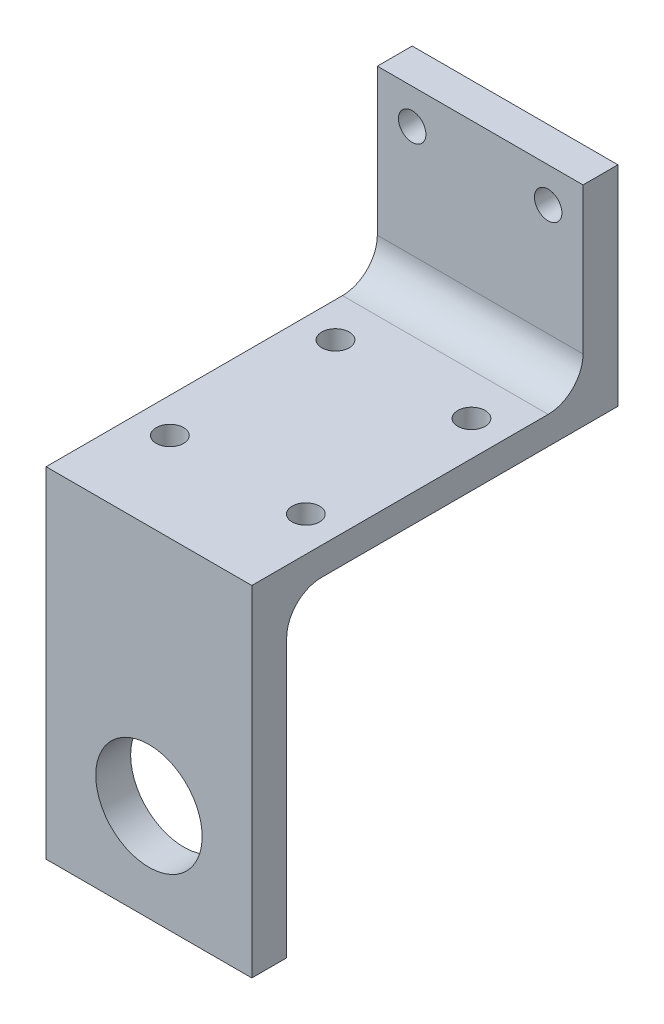
ISO-10303-21;
HEADER;
FILE_DESCRIPTION(('STEP AP214'),'2;1');
FILE_NAME('part.step','',(''),(''),'','','');
FILE_SCHEMA(('AUTOMOTIVE_DESIGN { 1 0 10303 214 1 1 1 1 }'));
ENDSEC;
DATA;
#1=APPLICATION_CONTEXT('core data for automotive mechanical design processes');
#2=APPLICATION_PROTOCOL_DEFINITION('international standard','automotive_design',2000,#1);
#3=PRODUCT_CONTEXT('',#1,'mechanical');
#4=PRODUCT('Part','Part','',(#3));
#5=PRODUCT_RELATED_PRODUCT_CATEGORY('part','',(#4));
#6=PRODUCT_DEFINITION_FORMATION('','',#4);
#7=PRODUCT_DEFINITION_CONTEXT('part definition',#1,'design');
#8=PRODUCT_DEFINITION('design','',#6,#7);
#9=PRODUCT_DEFINITION_SHAPE('','',#8);
#10=(LENGTH_UNIT() NAMED_UNIT(*) SI_UNIT(.MILLI.,.METRE.));
#11=(NAMED_UNIT(*) PLANE_ANGLE_UNIT() SI_UNIT($,.RADIAN.));
#12=(NAMED_UNIT(*) SI_UNIT($,.STERADIAN.) SOLID_ANGLE_UNIT());
#13=UNCERTAINTY_MEASURE_WITH_UNIT(LENGTH_MEASURE(1.E-05),#10,'distance_accuracy_value','');
#14=(GEOMETRIC_REPRESENTATION_CONTEXT(3) GLOBAL_UNCERTAINTY_ASSIGNED_CONTEXT((#13)) GLOBAL_UNIT_ASSIGNED_CONTEXT((#10,
#11,#12)) REPRESENTATION_CONTEXT('',''));
#15=CARTESIAN_POINT('',(0.,0.,0.));
#16=DIRECTION('',(0.,0.,1.));
#17=DIRECTION('',(1.,0.,0.));
#18=AXIS2_PLACEMENT_3D('',#15,#16,#17);
#19=CARTESIAN_POINT('',(29.972,0.,36.5701998870482));
#20=DIRECTION('',(0.,0.,-1.));
#21=DIRECTION('',(0.,1.,0.));
#22=AXIS2_PLACEMENT_3D('',#19,#20,#21);
#23=PLANE('',#22);
#24=CARTESIAN_POINT('',(14.986,-44.1568439202567,36.5701998870482));
#25=DIRECTION('',(0.,0.,-1.));
#26=DIRECTION('',(-1.,0.,0.));
#27=AXIS2_PLACEMENT_3D('',#24,#25,#26);
#28=CIRCLE('',#27,7.75);
#29=CARTESIAN_POINT('',(7.236,-44.1568439202567,36.5701998870482));
#30=VERTEX_POINT('',#29);
#31=EDGE_CURVE('E530',#30,#30,#28,.T.);
#32=ORIENTED_EDGE('',*,*,#31,.F.);
#33=EDGE_LOOP('',(#32));
#34=FACE_BOUND('',#33,.T.);
#35=DIRECTION('',(0.,-1.,0.));
#36=VECTOR('',#35,1.);
#37=CARTESIAN_POINT('',(0.,0.,36.5701998870482));
#38=LINE('',#37,#36);
#39=CARTESIAN_POINT('',(0.,-17.9948439202567,36.5701998870482));
#40=VERTEX_POINT('',#39);
#41=CARTESIAN_POINT('',(0.,-58.3808439202567,36.5701998870482));
#42=VERTEX_POINT('',#41);
#43=EDGE_CURVE('E207',#40,#42,#38,.T.);
#44=ORIENTED_EDGE('',*,*,#43,.F.);
#45=DIRECTION('',(-1.,0.,0.));
#46=VECTOR('',#45,1.);
#47=CARTESIAN_POINT('',(29.972,-17.9948439202567,36.5701998870482));
#48=LINE('',#47,#46);
#49=CARTESIAN_POINT('',(29.972,-17.9948439202567,36.5701998870482));
#50=VERTEX_POINT('',#49);
#51=EDGE_CURVE('E216',#40,#50,#48,.F.);
#52=ORIENTED_EDGE('',*,*,#51,.T.);
#53=DIRECTION('',(0.,-1.,0.));
#54=VECTOR('',#53,1.);
#55=CARTESIAN_POINT('',(29.972,0.,36.5701998870482));
#56=LINE('',#55,#54);
#57=CARTESIAN_POINT('',(29.972,-58.3808439202567,36.5701998870482));
#58=VERTEX_POINT('',#57);
#59=EDGE_CURVE('E260',#50,#58,#56,.T.);
#60=ORIENTED_EDGE('',*,*,#59,.T.);
#61=DIRECTION('',(-1.,0.,0.));
#62=VECTOR('',#61,1.);
#63=CARTESIAN_POINT('',(29.972,-58.3808439202567,36.5701998870482));
#64=LINE('',#63,#62);
#65=EDGE_CURVE('E267',#58,#42,#64,.T.);
#66=ORIENTED_EDGE('',*,*,#65,.T.);
#67=EDGE_LOOP('',(#44,#52,#60,#66));
#68=FACE_BOUND('',#67,.T.);
#69=ADVANCED_FACE('F71',(#34,#68),#23,.T.);
#70=CARTESIAN_POINT('',(29.972,0.,41.6501998870482));
#71=DIRECTION('',(0.,0.,-1.));
#72=DIRECTION('',(0.,1.,0.));
#73=AXIS2_PLACEMENT_3D('',#70,#71,#72);
#74=PLANE('',#73);
#75=CARTESIAN_POINT('',(14.986,-44.1568439202567,41.6501998870482));
#76=DIRECTION('',(0.,0.,-1.));
#77=DIRECTION('',(0.,1.,0.));
#78=AXIS2_PLACEMENT_3D('',#75,#76,#77);
#79=CIRCLE('',#78,7.75);
#80=CARTESIAN_POINT('',(14.986,-36.4068439202567,41.6501998870482));
#81=VERTEX_POINT('',#80);
#82=EDGE_CURVE('E528',#81,#81,#79,.F.);
#83=ORIENTED_EDGE('',*,*,#82,.F.);
#84=EDGE_LOOP('',(#83));
#85=FACE_BOUND('',#84,.T.);
#86=DIRECTION('',(0.,-1.,0.));
#87=VECTOR('',#86,1.);
#88=CARTESIAN_POINT('',(0.,0.,41.6501998870482));
#89=LINE('',#88,#87);
#90=CARTESIAN_POINT('',(0.,-8.85084392025667,41.6501998870482));
#91=VERTEX_POINT('',#90);
#92=CARTESIAN_POINT('',(0.,-58.3808439202567,41.6501998870482));
#93=VERTEX_POINT('',#92);
#94=EDGE_CURVE('E211',#91,#93,#89,.T.);
#95=ORIENTED_EDGE('',*,*,#94,.T.);
#96=DIRECTION('',(-1.,0.,0.));
#97=VECTOR('',#96,1.);
#98=CARTESIAN_POINT('',(29.972,-58.3808439202567,41.6501998870482));
#99=LINE('',#98,#97);
#100=CARTESIAN_POINT('',(29.972,-58.3808439202567,41.6501998870482));
#101=VERTEX_POINT('',#100);
#102=EDGE_CURVE('E217',#101,#93,#99,.T.);
#103=ORIENTED_EDGE('',*,*,#102,.F.);
#104=DIRECTION('',(0.,-1.,0.));
#105=VECTOR('',#104,1.);
#106=CARTESIAN_POINT('',(29.972,0.,41.6501998870482));
#107=LINE('',#106,#105);
#108=CARTESIAN_POINT('',(29.972,-8.85084392025667,41.6501998870482));
#109=VERTEX_POINT('',#108);
#110=EDGE_CURVE('E262',#109,#101,#107,.T.);
#111=ORIENTED_EDGE('',*,*,#110,.F.);
#112=DIRECTION('',(-1.,0.,0.));
#113=VECTOR('',#112,1.);
#114=CARTESIAN_POINT('',(29.972,-8.85084392025667,41.6501998870482));
#115=LINE('',#114,#113);
#116=EDGE_CURVE('E204',#109,#91,#115,.T.);
#117=ORIENTED_EDGE('',*,*,#116,.T.);
#118=EDGE_LOOP('',(#95,#103,#111,#117));
#119=FACE_BOUND('',#118,.T.);
#120=ADVANCED_FACE('F322',(#85,#119),#74,.F.);
#121=CARTESIAN_POINT('',(29.972,-58.3808439202567,0.));
#122=DIRECTION('',(0.,1.,0.));
#123=DIRECTION('',(0.,0.,1.));
#124=AXIS2_PLACEMENT_3D('',#121,#122,#123);
#125=PLANE('',#124);
#126=DIRECTION('',(0.,0.,-1.));
#127=VECTOR('',#126,1.);
#128=CARTESIAN_POINT('',(0.,-58.3808439202567,0.));
#129=LINE('',#128,#127);
#130=EDGE_CURVE('E263',#93,#42,#129,.T.);
#131=ORIENTED_EDGE('',*,*,#130,.T.);
#132=ORIENTED_EDGE('',*,*,#65,.F.);
#133=DIRECTION('',(0.,0.,-1.));
#134=VECTOR('',#133,1.);
#135=CARTESIAN_POINT('',(29.972,-58.3808439202567,0.));
#136=LINE('',#135,#134);
#137=EDGE_CURVE('E265',#101,#58,#136,.T.);
#138=ORIENTED_EDGE('',*,*,#137,.F.);
#139=ORIENTED_EDGE('',*,*,#102,.T.);
#140=EDGE_LOOP('',(#131,#132,#138,#139));
#141=FACE_BOUND('',#140,.T.);
#142=ADVANCED_FACE('F327',(#141),#125,.F.);
#143=CARTESIAN_POINT('',(29.972,0.,0.));
#144=DIRECTION('',(1.,0.,0.));
#145=DIRECTION('',(0.,0.,-1.));
#146=AXIS2_PLACEMENT_3D('',#143,#144,#145);
#147=PLANE('',#146);
#148=ORIENTED_EDGE('',*,*,#59,.F.);
#149=CARTESIAN_POINT('',(29.972,-17.9948439202567,31.4901998870482));
#150=DIRECTION('',(1.,0.,0.));
#151=DIRECTION('',(0.,0.,-1.));
#152=AXIS2_PLACEMENT_3D('',#149,#150,#151);
#153=CIRCLE('',#152,5.08);
#154=CARTESIAN_POINT('',(29.972,-12.9148439202567,31.4901998870482));
#155=VERTEX_POINT('',#154);
#156=EDGE_CURVE('E226',#50,#155,#153,.F.);
#157=ORIENTED_EDGE('',*,*,#156,.T.);
#158=DIRECTION('',(0.,0.,1.));
#159=VECTOR('',#158,1.);
#160=CARTESIAN_POINT('',(29.972,-12.9148439202567,-11.6898001129518));
#161=LINE('',#160,#159);
#162=CARTESIAN_POINT('',(29.972,-12.9148439202567,-11.6898001129518));
#163=VERTEX_POINT('',#162);
#164=EDGE_CURVE('E278',#163,#155,#161,.T.);
#165=ORIENTED_EDGE('',*,*,#164,.F.);
#166=DIRECTION('',(0.,-1.,0.));
#167=VECTOR('',#166,1.);
#168=CARTESIAN_POINT('',(29.972,17.5651560797433,-11.6898001129518));
#169=LINE('',#168,#167);
#170=CARTESIAN_POINT('',(29.972,17.5651560797433,-11.6898001129518));
#171=VERTEX_POINT('',#170);
#172=EDGE_CURVE('E282',#171,#163,#169,.T.);
#173=ORIENTED_EDGE('',*,*,#172,.F.);
#174=DIRECTION('',(0.,0.,-1.));
#175=VECTOR('',#174,1.);
#176=CARTESIAN_POINT('',(29.972,17.5651560797433,-6.60980011295181));
#177=LINE('',#176,#175);
#178=CARTESIAN_POINT('',(29.972,17.5651560797433,-6.60980011295181));
#179=VERTEX_POINT('',#178);
#180=EDGE_CURVE('E284',#179,#171,#177,.T.);
#181=ORIENTED_EDGE('',*,*,#180,.F.);
#182=DIRECTION('',(0.,1.,0.));
#183=VECTOR('',#182,1.);
#184=CARTESIAN_POINT('',(29.972,-8.85084392025666,-6.60980011295181));
#185=LINE('',#184,#183);
#186=CARTESIAN_POINT('',(29.972,-3.77084392025666,-6.60980011295181));
#187=VERTEX_POINT('',#186);
#188=EDGE_CURVE('E287',#187,#179,#185,.T.);
#189=ORIENTED_EDGE('',*,*,#188,.F.);
#190=CARTESIAN_POINT('',(29.972,-3.77084392025666,-1.52980011295181));
#191=DIRECTION('',(1.,0.,0.));
#192=DIRECTION('',(0.,0.,-1.));
#193=AXIS2_PLACEMENT_3D('',#190,#191,#192);
#194=CIRCLE('',#193,5.08);
#195=CARTESIAN_POINT('',(29.972,-8.85084392025666,-1.52980011295181));
#196=VERTEX_POINT('',#195);
#197=EDGE_CURVE('E230',#187,#196,#194,.F.);
#198=ORIENTED_EDGE('',*,*,#197,.T.);
#199=DIRECTION('',(0.,0.,1.));
#200=VECTOR('',#199,1.);
#201=CARTESIAN_POINT('',(29.972,-8.85084392025666,-6.60980011295181));
#202=LINE('',#201,#200);
#203=EDGE_CURVE('E276',#196,#109,#202,.T.);
#204=ORIENTED_EDGE('',*,*,#203,.T.);
#205=ORIENTED_EDGE('',*,*,#110,.T.);
#206=ORIENTED_EDGE('',*,*,#137,.T.);
#207=EDGE_LOOP('',(#148,#157,#165,#173,#181,#189,#198,#204,#205,#206));
#208=FACE_BOUND('',#207,.T.);
#209=ADVANCED_FACE('F320',(#208),#147,.T.);
#210=CARTESIAN_POINT('',(0.,0.,0.));
#211=DIRECTION('',(1.,0.,0.));
#212=DIRECTION('',(0.,0.,-1.));
#213=AXIS2_PLACEMENT_3D('',#210,#211,#212);
#214=PLANE('',#213);
#215=DIRECTION('',(0.,0.,1.));
#216=VECTOR('',#215,1.);
#217=CARTESIAN_POINT('',(0.,-12.9148439202567,-11.6898001129518));
#218=LINE('',#217,#216);
#219=CARTESIAN_POINT('',(0.,-12.9148439202567,-11.6898001129518));
#220=VERTEX_POINT('',#219);
#221=CARTESIAN_POINT('',(0.,-12.9148439202567,31.4901998870482));
#222=VERTEX_POINT('',#221);
#223=EDGE_CURVE('E195',#220,#222,#218,.T.);
#224=ORIENTED_EDGE('',*,*,#223,.T.);
#225=CARTESIAN_POINT('',(0.,-17.9948439202567,31.4901998870482));
#226=DIRECTION('',(1.,0.,0.));
#227=DIRECTION('',(0.,0.,-1.));
#228=AXIS2_PLACEMENT_3D('',#225,#226,#227);
#229=CIRCLE('',#228,5.08);
#230=EDGE_CURVE('E224',#222,#40,#229,.T.);
#231=ORIENTED_EDGE('',*,*,#230,.T.);
#232=ORIENTED_EDGE('',*,*,#43,.T.);
#233=ORIENTED_EDGE('',*,*,#130,.F.);
#234=ORIENTED_EDGE('',*,*,#94,.F.);
#235=DIRECTION('',(0.,0.,1.));
#236=VECTOR('',#235,1.);
#237=CARTESIAN_POINT('',(0.,-8.85084392025666,-6.60980011295181));
#238=LINE('',#237,#236);
#239=CARTESIAN_POINT('',(0.,-8.85084392025666,-1.52980011295181));
#240=VERTEX_POINT('',#239);
#241=EDGE_CURVE('E259',#240,#91,#238,.T.);
#242=ORIENTED_EDGE('',*,*,#241,.F.);
#243=CARTESIAN_POINT('',(0.,-3.77084392025666,-1.52980011295181));
#244=DIRECTION('',(1.,0.,0.));
#245=DIRECTION('',(0.,0.,-1.));
#246=AXIS2_PLACEMENT_3D('',#243,#244,#245);
#247=CIRCLE('',#246,5.08);
#248=CARTESIAN_POINT('',(0.,-3.77084392025666,-6.60980011295181));
#249=VERTEX_POINT('',#248);
#250=EDGE_CURVE('E228',#240,#249,#247,.T.);
#251=ORIENTED_EDGE('',*,*,#250,.T.);
#252=DIRECTION('',(0.,1.,0.));
#253=VECTOR('',#252,1.);
#254=CARTESIAN_POINT('',(0.,-8.85084392025666,-6.60980011295181));
#255=LINE('',#254,#253);
#256=CARTESIAN_POINT('',(0.,17.5651560797433,-6.60980011295181));
#257=VERTEX_POINT('',#256);
#258=EDGE_CURVE('E279',#249,#257,#255,.T.);
#259=ORIENTED_EDGE('',*,*,#258,.T.);
#260=DIRECTION('',(0.,0.,-1.));
#261=VECTOR('',#260,1.);
#262=CARTESIAN_POINT('',(0.,17.5651560797433,-6.60980011295181));
#263=LINE('',#262,#261);
#264=CARTESIAN_POINT('',(0.,17.5651560797433,-11.6898001129518));
#265=VERTEX_POINT('',#264);
#266=EDGE_CURVE('E293',#257,#265,#263,.T.);
#267=ORIENTED_EDGE('',*,*,#266,.T.);
#268=DIRECTION('',(0.,-1.,0.));
#269=VECTOR('',#268,1.);
#270=CARTESIAN_POINT('',(0.,17.5651560797433,-11.6898001129518));
#271=LINE('',#270,#269);
#272=EDGE_CURVE('E291',#265,#220,#271,.T.);
#273=ORIENTED_EDGE('',*,*,#272,.T.);
#274=EDGE_LOOP('',(#224,#231,#232,#233,#234,#242,#251,#259,#267,#273));
#275=FACE_BOUND('',#274,.T.);
#276=ADVANCED_FACE('F309',(#275),#214,.F.);
#277=CARTESIAN_POINT('',(29.972,-8.85084392025666,-6.60980011295181));
#278=DIRECTION('',(0.,0.,1.));
#279=DIRECTION('',(1.,0.,0.));
#280=AXIS2_PLACEMENT_3D('',#277,#278,#279);
#281=PLANE('',#280);
#282=CARTESIAN_POINT('',(5.08,12.4851560797433,-6.60980011295181));
#283=DIRECTION('',(0.,0.,1.));
#284=DIRECTION('',(1.,0.,0.));
#285=AXIS2_PLACEMENT_3D('',#282,#283,#284);
#286=CIRCLE('',#285,2.);
#287=CARTESIAN_POINT('',(7.08,12.4851560797433,-6.60980011295181));
#288=VERTEX_POINT('',#287);
#289=EDGE_CURVE('E247',#288,#288,#286,.F.);
#290=ORIENTED_EDGE('',*,*,#289,.T.);
#291=EDGE_LOOP('',(#290));
#292=FACE_BOUND('',#291,.T.);
#293=CARTESIAN_POINT('',(24.892,12.4851560797433,-6.60980011295181));
#294=DIRECTION('',(0.,0.,1.));
#295=DIRECTION('',(1.,0.,0.));
#296=AXIS2_PLACEMENT_3D('',#293,#294,#295);
#297=CIRCLE('',#296,2.);
#298=CARTESIAN_POINT('',(26.892,12.4851560797433,-6.60980011295181));
#299=VERTEX_POINT('',#298);
#300=EDGE_CURVE('E256',#299,#299,#297,.F.);
#301=ORIENTED_EDGE('',*,*,#300,.T.);
#302=EDGE_LOOP('',(#301));
#303=FACE_BOUND('',#302,.T.);
#304=ORIENTED_EDGE('',*,*,#258,.F.);
#305=DIRECTION('',(-1.,0.,0.));
#306=VECTOR('',#305,1.);
#307=CARTESIAN_POINT('',(29.972,-3.77084392025666,-6.60980011295181));
#308=LINE('',#307,#306);
#309=EDGE_CURVE('E222',#249,#187,#308,.F.);
#310=ORIENTED_EDGE('',*,*,#309,.T.);
#311=ORIENTED_EDGE('',*,*,#188,.T.);
#312=DIRECTION('',(-1.,0.,0.));
#313=VECTOR('',#312,1.);
#314=CARTESIAN_POINT('',(29.972,17.5651560797433,-6.60980011295181));
#315=LINE('',#314,#313);
#316=EDGE_CURVE('E200',#179,#257,#315,.T.);
#317=ORIENTED_EDGE('',*,*,#316,.T.);
#318=EDGE_LOOP('',(#304,#310,#311,#317));
#319=FACE_BOUND('',#318,.T.);
#320=ADVANCED_FACE('F302',(#292,#303,#319),#281,.T.);
#321=CARTESIAN_POINT('',(29.972,17.5651560797433,-6.60980011295181));
#322=DIRECTION('',(0.,1.,0.));
#323=DIRECTION('',(0.,0.,1.));
#324=AXIS2_PLACEMENT_3D('',#321,#322,#323);
#325=PLANE('',#324);
#326=ORIENTED_EDGE('',*,*,#266,.F.);
#327=ORIENTED_EDGE('',*,*,#316,.F.);
#328=ORIENTED_EDGE('',*,*,#180,.T.);
#329=DIRECTION('',(-1.,0.,0.));
#330=VECTOR('',#329,1.);
#331=CARTESIAN_POINT('',(29.972,17.5651560797433,-11.6898001129518));
#332=LINE('',#331,#330);
#333=EDGE_CURVE('E197',#171,#265,#332,.T.);
#334=ORIENTED_EDGE('',*,*,#333,.T.);
#335=EDGE_LOOP('',(#326,#327,#328,#334));
#336=FACE_BOUND('',#335,.T.);
#337=ADVANCED_FACE('F307',(#336),#325,.T.);
#338=CARTESIAN_POINT('',(29.972,-8.85084392025666,-6.60980011295181));
#339=DIRECTION('',(0.,-1.,0.));
#340=DIRECTION('',(0.,0.,-1.));
#341=AXIS2_PLACEMENT_3D('',#338,#339,#340);
#342=PLANE('',#341);
#343=CARTESIAN_POINT('',(5.08,-8.85084392025666,4.56619988704819));
#344=DIRECTION('',(0.,-1.,0.));
#345=DIRECTION('',(0.,0.,-1.));
#346=AXIS2_PLACEMENT_3D('',#343,#344,#345);
#347=CIRCLE('',#346,2.);
#348=CARTESIAN_POINT('',(5.08,-8.85084392025666,2.56619988704819));
#349=VERTEX_POINT('',#348);
#350=EDGE_CURVE('E251',#349,#349,#347,.T.);
#351=ORIENTED_EDGE('',*,*,#350,.T.);
#352=EDGE_LOOP('',(#351));
#353=FACE_BOUND('',#352,.T.);
#354=CARTESIAN_POINT('',(24.892,-8.85084392025666,28.6961998870482));
#355=DIRECTION('',(0.,-1.,0.));
#356=DIRECTION('',(0.,0.,-1.));
#357=AXIS2_PLACEMENT_3D('',#354,#355,#356);
#358=CIRCLE('',#357,2.);
#359=CARTESIAN_POINT('',(24.892,-8.85084392025666,26.6961998870482));
#360=VERTEX_POINT('',#359);
#361=EDGE_CURVE('E394',#360,#360,#358,.T.);
#362=ORIENTED_EDGE('',*,*,#361,.T.);
#363=EDGE_LOOP('',(#362));
#364=FACE_BOUND('',#363,.T.);
#365=CARTESIAN_POINT('',(5.08,-8.85084392025666,28.6961998870482));
#366=DIRECTION('',(0.,-1.,0.));
#367=DIRECTION('',(0.,0.,-1.));
#368=AXIS2_PLACEMENT_3D('',#365,#366,#367);
#369=CIRCLE('',#368,2.);
#370=CARTESIAN_POINT('',(5.08,-8.85084392025666,26.6961998870482));
#371=VERTEX_POINT('',#370);
#372=EDGE_CURVE('E387',#371,#371,#369,.T.);
#373=ORIENTED_EDGE('',*,*,#372,.T.);
#374=EDGE_LOOP('',(#373));
#375=FACE_BOUND('',#374,.T.);
#376=CARTESIAN_POINT('',(24.892,-8.85084392025666,4.56619988704819));
#377=DIRECTION('',(0.,-1.,0.));
#378=DIRECTION('',(0.,0.,-1.));
#379=AXIS2_PLACEMENT_3D('',#376,#377,#378);
#380=CIRCLE('',#379,2.);
#381=CARTESIAN_POINT('',(24.892,-8.85084392025666,2.56619988704819));
#382=VERTEX_POINT('',#381);
#383=EDGE_CURVE('E384',#382,#382,#380,.T.);
#384=ORIENTED_EDGE('',*,*,#383,.T.);
#385=EDGE_LOOP('',(#384));
#386=FACE_BOUND('',#385,.T.);
#387=ORIENTED_EDGE('',*,*,#203,.F.);
#388=DIRECTION('',(-1.,0.,0.));
#389=VECTOR('',#388,1.);
#390=CARTESIAN_POINT('',(29.972,-8.85084392025666,-1.52980011295181));
#391=LINE('',#390,#389);
#392=EDGE_CURVE('E219',#196,#240,#391,.T.);
#393=ORIENTED_EDGE('',*,*,#392,.T.);
#394=ORIENTED_EDGE('',*,*,#241,.T.);
#395=ORIENTED_EDGE('',*,*,#116,.F.);
#396=EDGE_LOOP('',(#387,#393,#394,#395));
#397=FACE_BOUND('',#396,.T.);
#398=ADVANCED_FACE('F317',(#353,#364,#375,#386,#397),#342,.F.);
#399=CARTESIAN_POINT('',(29.972,17.5651560797433,-11.6898001129518));
#400=DIRECTION('',(0.,0.,-1.));
#401=DIRECTION('',(0.,1.,0.));
#402=AXIS2_PLACEMENT_3D('',#399,#400,#401);
#403=PLANE('',#402);
#404=CARTESIAN_POINT('',(24.892,-11.6448439202567,-11.6898001129518));
#405=DIRECTION('',(0.,0.,-1.));
#406=DIRECTION('',(-1.,0.,0.));
#407=AXIS2_PLACEMENT_3D('',#404,#405,#406);
#408=CIRCLE('',#407,4.);
#409=CARTESIAN_POINT('',(21.0989669128783,-12.9148439202567,-11.6898001129518));
#410=VERTEX_POINT('',#409);
#411=CARTESIAN_POINT('',(28.6850330871217,-12.9148439202567,-11.6898001129518));
#412=VERTEX_POINT('',#411);
#413=EDGE_CURVE('E93',#410,#412,#408,.T.);
#414=ORIENTED_EDGE('',*,*,#413,.F.);
#415=DIRECTION('',(-1.,0.,0.));
#416=VECTOR('',#415,1.);
#417=CARTESIAN_POINT('',(29.972,-12.9148439202567,-11.6898001129518));
#418=LINE('',#417,#416);
#419=CARTESIAN_POINT('',(8.8730330871217,-12.9148439202567,-11.6898001129518));
#420=VERTEX_POINT('',#419);
#421=EDGE_CURVE('E188',#410,#420,#418,.T.);
#422=ORIENTED_EDGE('',*,*,#421,.T.);
#423=CARTESIAN_POINT('',(5.08,-11.6448439202567,-11.6898001129518));
#424=DIRECTION('',(0.,0.,-1.));
#425=DIRECTION('',(-1.,0.,0.));
#426=AXIS2_PLACEMENT_3D('',#423,#424,#425);
#427=CIRCLE('',#426,4.);
#428=CARTESIAN_POINT('',(1.28696691287829,-12.9148439202567,-11.6898001129518));
#429=VERTEX_POINT('',#428);
#430=EDGE_CURVE('E86',#429,#420,#427,.T.);
#431=ORIENTED_EDGE('',*,*,#430,.F.);
#432=EDGE_CURVE('E185',#429,#220,#418,.T.);
#433=ORIENTED_EDGE('',*,*,#432,.T.);
#434=ORIENTED_EDGE('',*,*,#272,.F.);
#435=ORIENTED_EDGE('',*,*,#333,.F.);
#436=ORIENTED_EDGE('',*,*,#172,.T.);
#437=EDGE_CURVE('E199',#163,#412,#418,.T.);
#438=ORIENTED_EDGE('',*,*,#437,.T.);
#439=EDGE_LOOP('',(#414,#422,#431,#433,#434,#435,#436,#438));
#440=FACE_BOUND('',#439,.T.);
#441=CARTESIAN_POINT('',(5.08,12.4851560797433,-11.6898001129518));
#442=DIRECTION('',(0.,0.,-1.));
#443=DIRECTION('',(-1.,0.,0.));
#444=AXIS2_PLACEMENT_3D('',#441,#442,#443);
#445=CIRCLE('',#444,2.);
#446=CARTESIAN_POINT('',(3.08,12.4851560797433,-11.6898001129518));
#447=VERTEX_POINT('',#446);
#448=EDGE_CURVE('E244',#447,#447,#445,.T.);
#449=ORIENTED_EDGE('',*,*,#448,.F.);
#450=EDGE_LOOP('',(#449));
#451=FACE_BOUND('',#450,.T.);
#452=CARTESIAN_POINT('',(24.892,12.4851560797433,-11.6898001129518));
#453=DIRECTION('',(0.,0.,-1.));
#454=DIRECTION('',(-1.,0.,0.));
#455=AXIS2_PLACEMENT_3D('',#452,#453,#454);
#456=CIRCLE('',#455,2.);
#457=CARTESIAN_POINT('',(22.892,12.4851560797433,-11.6898001129518));
#458=VERTEX_POINT('',#457);
#459=EDGE_CURVE('E253',#458,#458,#456,.T.);
#460=ORIENTED_EDGE('',*,*,#459,.F.);
#461=EDGE_LOOP('',(#460));
#462=FACE_BOUND('',#461,.T.);
#463=ADVANCED_FACE('F182',(#440,#451,#462),#403,.T.);
#464=CARTESIAN_POINT('',(29.972,-12.9148439202567,-11.6898001129518));
#465=DIRECTION('',(0.,-1.,0.));
#466=DIRECTION('',(0.,0.,-1.));
#467=AXIS2_PLACEMENT_3D('',#464,#465,#466);
#468=PLANE('',#467);
#469=CARTESIAN_POINT('',(5.08,-12.9148439202567,4.56619988704819));
#470=DIRECTION('',(0.,-1.,0.));
#471=DIRECTION('',(0.,0.,-1.));
#472=AXIS2_PLACEMENT_3D('',#469,#470,#471);
#473=CIRCLE('',#472,2.);
#474=CARTESIAN_POINT('',(5.08,-12.9148439202567,2.56619988704819));
#475=VERTEX_POINT('',#474);
#476=EDGE_CURVE('E371',#475,#475,#473,.T.);
#477=ORIENTED_EDGE('',*,*,#476,.F.);
#478=EDGE_LOOP('',(#477));
#479=FACE_BOUND('',#478,.T.);
#480=CARTESIAN_POINT('',(24.892,-12.9148439202567,28.6961998870482));
#481=DIRECTION('',(0.,-1.,0.));
#482=DIRECTION('',(0.,0.,-1.));
#483=AXIS2_PLACEMENT_3D('',#480,#481,#482);
#484=CIRCLE('',#483,2.);
#485=CARTESIAN_POINT('',(24.892,-12.9148439202567,26.6961998870482));
#486=VERTEX_POINT('',#485);
#487=EDGE_CURVE('E375',#486,#486,#484,.T.);
#488=ORIENTED_EDGE('',*,*,#487,.F.);
#489=EDGE_LOOP('',(#488));
#490=FACE_BOUND('',#489,.T.);
#491=CARTESIAN_POINT('',(5.08,-12.9148439202567,28.6961998870482));
#492=DIRECTION('',(0.,-1.,0.));
#493=DIRECTION('',(0.,0.,-1.));
#494=AXIS2_PLACEMENT_3D('',#491,#492,#493);
#495=CIRCLE('',#494,2.);
#496=CARTESIAN_POINT('',(5.08,-12.9148439202567,26.6961998870482));
#497=VERTEX_POINT('',#496);
#498=EDGE_CURVE('E379',#497,#497,#495,.T.);
#499=ORIENTED_EDGE('',*,*,#498,.F.);
#500=EDGE_LOOP('',(#499));
#501=FACE_BOUND('',#500,.T.);
#502=CARTESIAN_POINT('',(24.892,-12.9148439202567,4.56619988704819));
#503=DIRECTION('',(0.,-1.,0.));
#504=DIRECTION('',(0.,0.,-1.));
#505=AXIS2_PLACEMENT_3D('',#502,#503,#504);
#506=CIRCLE('',#505,2.);
#507=CARTESIAN_POINT('',(24.892,-12.9148439202567,2.56619988704819));
#508=VERTEX_POINT('',#507);
#509=EDGE_CURVE('E382',#508,#508,#506,.T.);
#510=ORIENTED_EDGE('',*,*,#509,.F.);
#511=EDGE_LOOP('',(#510));
#512=FACE_BOUND('',#511,.T.);
#513=DIRECTION('',(0.,0.,-1.));
#514=VECTOR('',#513,1.);
#515=CARTESIAN_POINT('',(21.0989669128783,-12.9148439202567,4.70390838603295));
#516=LINE('',#515,#514);
#517=CARTESIAN_POINT('',(21.0989669128783,-12.9148439202567,-6.60980011295181));
#518=VERTEX_POINT('',#517);
#519=EDGE_CURVE('E12',#518,#410,#516,.T.);
#520=ORIENTED_EDGE('',*,*,#519,.F.);
#521=DIRECTION('',(-1.,0.,0.));
#522=VECTOR('',#521,1.);
#523=CARTESIAN_POINT('',(29.972,-12.9148439202567,-6.60980011295181));
#524=LINE('',#523,#522);
#525=CARTESIAN_POINT('',(28.6850330871217,-12.9148439202567,-6.60980011295181));
#526=VERTEX_POINT('',#525);
#527=EDGE_CURVE('E79',#526,#518,#524,.T.);
#528=ORIENTED_EDGE('',*,*,#527,.F.);
#529=DIRECTION('',(0.,0.,-1.));
#530=VECTOR('',#529,1.);
#531=CARTESIAN_POINT('',(28.6850330871217,-12.9148439202567,4.70390838603295));
#532=LINE('',#531,#530);
#533=EDGE_CURVE('E177',#412,#526,#532,.F.);
#534=ORIENTED_EDGE('',*,*,#533,.F.);
#535=ORIENTED_EDGE('',*,*,#437,.F.);
#536=ORIENTED_EDGE('',*,*,#164,.T.);
#537=DIRECTION('',(-1.,0.,0.));
#538=VECTOR('',#537,1.);
#539=CARTESIAN_POINT('',(0.,-12.9148439202567,31.4901998870482));
#540=LINE('',#539,#538);
#541=EDGE_CURVE('E214',#155,#222,#540,.T.);
#542=ORIENTED_EDGE('',*,*,#541,.T.);
#543=ORIENTED_EDGE('',*,*,#223,.F.);
#544=ORIENTED_EDGE('',*,*,#432,.F.);
#545=DIRECTION('',(0.,0.,-1.));
#546=VECTOR('',#545,1.);
#547=CARTESIAN_POINT('',(1.28696691287829,-12.9148439202567,4.70390838603295));
#548=LINE('',#547,#546);
#549=CARTESIAN_POINT('',(1.28696691287829,-12.9148439202567,-6.60980011295181));
#550=VERTEX_POINT('',#549);
#551=EDGE_CURVE('E170',#550,#429,#548,.T.);
#552=ORIENTED_EDGE('',*,*,#551,.F.);
#553=DIRECTION('',(-1.,0.,0.));
#554=VECTOR('',#553,1.);
#555=CARTESIAN_POINT('',(29.972,-12.9148439202567,-6.60980011295181));
#556=LINE('',#555,#554);
#557=CARTESIAN_POINT('',(8.8730330871217,-12.9148439202567,-6.60980011295181));
#558=VERTEX_POINT('',#557);
#559=EDGE_CURVE('E178',#558,#550,#556,.T.);
#560=ORIENTED_EDGE('',*,*,#559,.F.);
#561=DIRECTION('',(0.,0.,-1.));
#562=VECTOR('',#561,1.);
#563=CARTESIAN_POINT('',(8.8730330871217,-12.9148439202567,4.70390838603295));
#564=LINE('',#563,#562);
#565=EDGE_CURVE('E232',#420,#558,#564,.F.);
#566=ORIENTED_EDGE('',*,*,#565,.F.);
#567=ORIENTED_EDGE('',*,*,#421,.F.);
#568=EDGE_LOOP('',(#520,#528,#534,#535,#536,#542,#543,#544,#552,#560,#566,#567));
#569=FACE_BOUND('',#568,.T.);
#570=ADVANCED_FACE('F192',(#479,#490,#501,#512,#569),#468,.T.);
#571=CARTESIAN_POINT('',(29.972,-17.9948439202567,31.4901998870482));
#572=DIRECTION('',(1.,0.,0.));
#573=DIRECTION('',(0.,0.,-1.));
#574=AXIS2_PLACEMENT_3D('',#571,#572,#573);
#575=CYLINDRICAL_SURFACE('',#574,5.08);
#576=ORIENTED_EDGE('',*,*,#156,.F.);
#577=ORIENTED_EDGE('',*,*,#51,.F.);
#578=ORIENTED_EDGE('',*,*,#230,.F.);
#579=ORIENTED_EDGE('',*,*,#541,.F.);
#580=EDGE_LOOP('',(#576,#577,#578,#579));
#581=FACE_BOUND('',#580,.T.);
#582=ADVANCED_FACE('F334',(#581),#575,.F.);
#583=CARTESIAN_POINT('',(29.972,-3.77084392025666,-1.52980011295181));
#584=DIRECTION('',(-1.,0.,0.));
#585=DIRECTION('',(0.,0.,1.));
#586=AXIS2_PLACEMENT_3D('',#583,#584,#585);
#587=CYLINDRICAL_SURFACE('',#586,5.08);
#588=ORIENTED_EDGE('',*,*,#197,.F.);
#589=ORIENTED_EDGE('',*,*,#309,.F.);
#590=ORIENTED_EDGE('',*,*,#250,.F.);
#591=ORIENTED_EDGE('',*,*,#392,.F.);
#592=EDGE_LOOP('',(#588,#589,#590,#591));
#593=FACE_BOUND('',#592,.T.);
#594=ADVANCED_FACE('F73',(#593),#587,.F.);
#595=CARTESIAN_POINT('',(29.972,-8.85084392025666,-6.60980011295181));
#596=DIRECTION('',(0.,0.,1.));
#597=DIRECTION('',(1.,0.,0.));
#598=AXIS2_PLACEMENT_3D('',#595,#596,#597);
#599=PLANE('',#598);
#600=ORIENTED_EDGE('',*,*,#559,.T.);
#601=CARTESIAN_POINT('',(5.08,-11.6448439202567,-6.60980011295181));
#602=DIRECTION('',(0.,0.,1.));
#603=DIRECTION('',(1.,0.,0.));
#604=AXIS2_PLACEMENT_3D('',#601,#602,#603);
#605=CIRCLE('',#604,4.);
#606=EDGE_CURVE('E173',#550,#558,#605,.F.);
#607=ORIENTED_EDGE('',*,*,#606,.T.);
#608=EDGE_LOOP('',(#600,#607));
#609=FACE_BOUND('',#608,.T.);
#610=ADVANCED_FACE('F243',(#609),#599,.F.);
#611=CARTESIAN_POINT('',(5.08,-11.6448439202567,4.70390838603295));
#612=DIRECTION('',(0.,0.,-1.));
#613=DIRECTION('',(-1.,0.,0.));
#614=AXIS2_PLACEMENT_3D('',#611,#612,#613);
#615=CYLINDRICAL_SURFACE('',#614,4.);
#616=ORIENTED_EDGE('',*,*,#551,.T.);
#617=ORIENTED_EDGE('',*,*,#430,.T.);
#618=ORIENTED_EDGE('',*,*,#565,.T.);
#619=ORIENTED_EDGE('',*,*,#606,.F.);
#620=EDGE_LOOP('',(#616,#617,#618,#619));
#621=FACE_BOUND('',#620,.T.);
#622=ADVANCED_FACE('F171',(#621),#615,.F.);
#623=CARTESIAN_POINT('',(29.972,-8.85084392025666,-6.60980011295181));
#624=DIRECTION('',(0.,0.,1.));
#625=DIRECTION('',(1.,0.,0.));
#626=AXIS2_PLACEMENT_3D('',#623,#624,#625);
#627=PLANE('',#626);
#628=ORIENTED_EDGE('',*,*,#527,.T.);
#629=CARTESIAN_POINT('',(24.892,-11.6448439202567,-6.60980011295181));
#630=DIRECTION('',(0.,0.,1.));
#631=DIRECTION('',(1.,0.,0.));
#632=AXIS2_PLACEMENT_3D('',#629,#630,#631);
#633=CIRCLE('',#632,4.);
#634=EDGE_CURVE('E189',#518,#526,#633,.F.);
#635=ORIENTED_EDGE('',*,*,#634,.T.);
#636=EDGE_LOOP('',(#628,#635));
#637=FACE_BOUND('',#636,.T.);
#638=ADVANCED_FACE('F239',(#637),#627,.F.);
#639=CARTESIAN_POINT('',(24.892,-11.6448439202567,4.70390838603295));
#640=DIRECTION('',(0.,0.,-1.));
#641=DIRECTION('',(-1.,0.,0.));
#642=AXIS2_PLACEMENT_3D('',#639,#640,#641);
#643=CYLINDRICAL_SURFACE('',#642,4.);
#644=ORIENTED_EDGE('',*,*,#519,.T.);
#645=ORIENTED_EDGE('',*,*,#413,.T.);
#646=ORIENTED_EDGE('',*,*,#533,.T.);
#647=ORIENTED_EDGE('',*,*,#634,.F.);
#648=EDGE_LOOP('',(#644,#645,#646,#647));
#649=FACE_BOUND('',#648,.T.);
#650=ADVANCED_FACE('F240',(#649),#643,.F.);
#651=CARTESIAN_POINT('',(24.892,12.4851560797433,4.70390838603295));
#652=DIRECTION('',(0.,0.,-1.));
#653=DIRECTION('',(-1.,0.,0.));
#654=AXIS2_PLACEMENT_3D('',#651,#652,#653);
#655=CYLINDRICAL_SURFACE('',#654,2.);
#656=ORIENTED_EDGE('',*,*,#459,.T.);
#657=EDGE_LOOP('',(#656));
#658=FACE_BOUND('',#657,.T.);
#659=ORIENTED_EDGE('',*,*,#300,.F.);
#660=EDGE_LOOP('',(#659));
#661=FACE_BOUND('',#660,.T.);
#662=ADVANCED_FACE('F403',(#658,#661),#655,.F.);
#663=CARTESIAN_POINT('',(5.08,12.4851560797433,4.70390838603295));
#664=DIRECTION('',(0.,0.,-1.));
#665=DIRECTION('',(-1.,0.,0.));
#666=AXIS2_PLACEMENT_3D('',#663,#664,#665);
#667=CYLINDRICAL_SURFACE('',#666,2.);
#668=ORIENTED_EDGE('',*,*,#448,.T.);
#669=EDGE_LOOP('',(#668));
#670=FACE_BOUND('',#669,.T.);
#671=ORIENTED_EDGE('',*,*,#289,.F.);
#672=EDGE_LOOP('',(#671));
#673=FACE_BOUND('',#672,.T.);
#674=ADVANCED_FACE('F401',(#670,#673),#667,.F.);
#675=CARTESIAN_POINT('',(24.892,17.0571560797433,4.5661998870482));
#676=DIRECTION('',(0.,-1.,0.));
#677=DIRECTION('',(0.,0.,-1.));
#678=AXIS2_PLACEMENT_3D('',#675,#676,#677);
#679=CYLINDRICAL_SURFACE('',#678,2.);
#680=ORIENTED_EDGE('',*,*,#509,.T.);
#681=EDGE_LOOP('',(#680));
#682=FACE_BOUND('',#681,.T.);
#683=ORIENTED_EDGE('',*,*,#383,.F.);
#684=EDGE_LOOP('',(#683));
#685=FACE_BOUND('',#684,.T.);
#686=ADVANCED_FACE('F402',(#682,#685),#679,.F.);
#687=CARTESIAN_POINT('',(5.08,17.0571560797433,28.6961998870482));
#688=DIRECTION('',(0.,-1.,0.));
#689=DIRECTION('',(0.,0.,-1.));
#690=AXIS2_PLACEMENT_3D('',#687,#688,#689);
#691=CYLINDRICAL_SURFACE('',#690,2.);
#692=ORIENTED_EDGE('',*,*,#498,.T.);
#693=EDGE_LOOP('',(#692));
#694=FACE_BOUND('',#693,.T.);
#695=ORIENTED_EDGE('',*,*,#372,.F.);
#696=EDGE_LOOP('',(#695));
#697=FACE_BOUND('',#696,.T.);
#698=ADVANCED_FACE('F409',(#694,#697),#691,.F.);
#699=CARTESIAN_POINT('',(24.892,17.0571560797433,28.6961998870482));
#700=DIRECTION('',(0.,-1.,0.));
#701=DIRECTION('',(0.,0.,-1.));
#702=AXIS2_PLACEMENT_3D('',#699,#700,#701);
#703=CYLINDRICAL_SURFACE('',#702,2.);
#704=ORIENTED_EDGE('',*,*,#487,.T.);
#705=EDGE_LOOP('',(#704));
#706=FACE_BOUND('',#705,.T.);
#707=ORIENTED_EDGE('',*,*,#361,.F.);
#708=EDGE_LOOP('',(#707));
#709=FACE_BOUND('',#708,.T.);
#710=ADVANCED_FACE('F493',(#706,#709),#703,.F.);
#711=CARTESIAN_POINT('',(5.08,17.0571560797433,4.5661998870482));
#712=DIRECTION('',(0.,-1.,0.));
#713=DIRECTION('',(0.,0.,-1.));
#714=AXIS2_PLACEMENT_3D('',#711,#712,#713);
#715=CYLINDRICAL_SURFACE('',#714,2.);
#716=ORIENTED_EDGE('',*,*,#476,.T.);
#717=EDGE_LOOP('',(#716));
#718=FACE_BOUND('',#717,.T.);
#719=ORIENTED_EDGE('',*,*,#350,.F.);
#720=EDGE_LOOP('',(#719));
#721=FACE_BOUND('',#720,.T.);
#722=ADVANCED_FACE('F501',(#718,#721),#715,.F.);
#723=CARTESIAN_POINT('',(14.986,-44.1568439202567,63.5705101038312));
#724=DIRECTION('',(0.,0.,-1.));
#725=DIRECTION('',(-1.,0.,0.));
#726=AXIS2_PLACEMENT_3D('',#723,#724,#725);
#727=CYLINDRICAL_SURFACE('',#726,7.75);
#728=ORIENTED_EDGE('',*,*,#82,.T.);
#729=EDGE_LOOP('',(#728));
#730=FACE_BOUND('',#729,.T.);
#731=ORIENTED_EDGE('',*,*,#31,.T.);
#732=EDGE_LOOP('',(#731));
#733=FACE_BOUND('',#732,.T.);
#734=ADVANCED_FACE('F507',(#730,#733),#727,.F.);
#735=CLOSED_SHELL('',(#69,#120,#142,#209,#276,#320,#337,#398,#463,#570,#582,#594,#610,#622,#638,
#650,#662,#674,#686,#698,#710,#722,#734));
#736=MANIFOLD_SOLID_BREP('B2',#735);
#737=ADVANCED_BREP_SHAPE_REPRESENTATION('',(#18,#736),#14);
#738=SHAPE_DEFINITION_REPRESENTATION(#9,#737);
ENDSEC;
END-ISO-10303-21;
